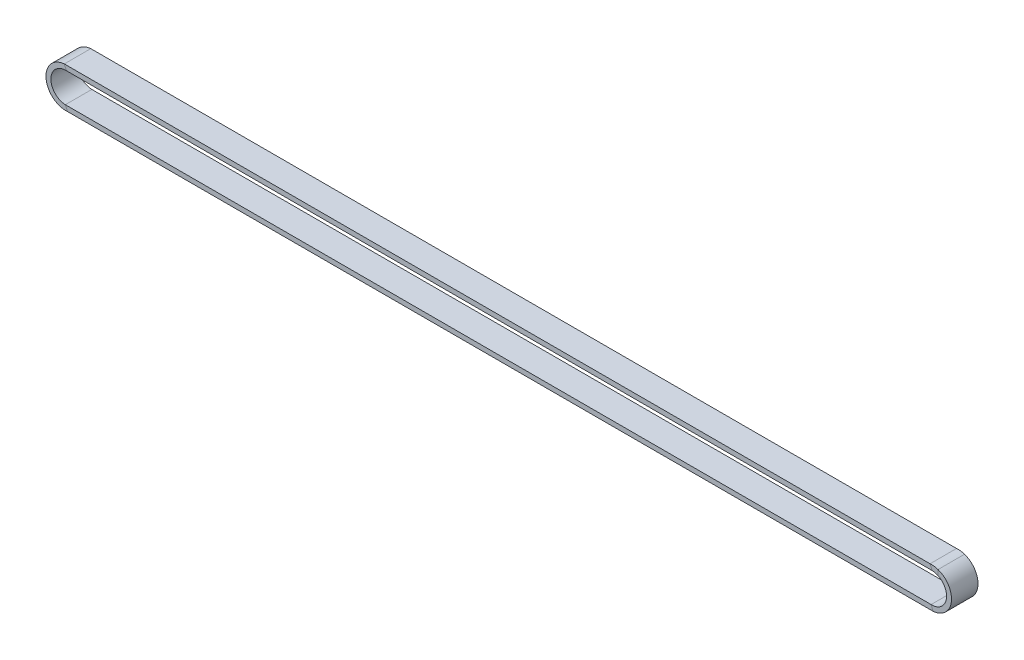
ISO-10303-21;
HEADER;
FILE_DESCRIPTION(('STEP AP214'),'2;1');
FILE_NAME('part.step','',(''),(''),'','','');
FILE_SCHEMA(('AUTOMOTIVE_DESIGN { 1 0 10303 214 1 1 1 1 }'));
ENDSEC;
DATA;
#1=APPLICATION_CONTEXT('core data for automotive mechanical design processes');
#2=APPLICATION_PROTOCOL_DEFINITION('international standard','automotive_design',2000,#1);
#3=PRODUCT_CONTEXT('',#1,'mechanical');
#4=PRODUCT('Part','Part','',(#3));
#5=PRODUCT_RELATED_PRODUCT_CATEGORY('part','',(#4));
#6=PRODUCT_DEFINITION_FORMATION('','',#4);
#7=PRODUCT_DEFINITION_CONTEXT('part definition',#1,'design');
#8=PRODUCT_DEFINITION('design','',#6,#7);
#9=PRODUCT_DEFINITION_SHAPE('','',#8);
#10=(LENGTH_UNIT() NAMED_UNIT(*) SI_UNIT(.MILLI.,.METRE.));
#11=(NAMED_UNIT(*) PLANE_ANGLE_UNIT() SI_UNIT($,.RADIAN.));
#12=(NAMED_UNIT(*) SI_UNIT($,.STERADIAN.) SOLID_ANGLE_UNIT());
#13=UNCERTAINTY_MEASURE_WITH_UNIT(LENGTH_MEASURE(1.E-05),#10,'distance_accuracy_value','');
#14=(GEOMETRIC_REPRESENTATION_CONTEXT(3) GLOBAL_UNCERTAINTY_ASSIGNED_CONTEXT((#13)) GLOBAL_UNIT_ASSIGNED_CONTEXT((#10,
#11,#12)) REPRESENTATION_CONTEXT('',''));
#15=CARTESIAN_POINT('',(0.,0.,0.));
#16=DIRECTION('',(0.,0.,1.));
#17=DIRECTION('',(1.,0.,0.));
#18=AXIS2_PLACEMENT_3D('',#15,#16,#17);
#19=CARTESIAN_POINT('',(-2.42477796092733,27.5000000000043,0.));
#20=DIRECTION('',(0.,0.,-1.));
#21=DIRECTION('',(-1.,0.,0.));
#22=AXIS2_PLACEMENT_3D('',#19,#20,#21);
#23=CYLINDRICAL_SURFACE('',#22,5.65810645935928);
#24=CARTESIAN_POINT('',(-2.42477796092733,27.5000000000043,5.));
#25=DIRECTION('',(0.,0.,-1.));
#26=DIRECTION('',(0.034948504451111,0.999389114427724,0.));
#27=AXIS2_PLACEMENT_3D('',#24,#25,#26);
#28=CIRCLE('',#27,5.65810645935928);
#29=CARTESIAN_POINT('',(-2.22703560214788,33.154650003761,5.));
#30=VERTEX_POINT('',#29);
#31=CARTESIAN_POINT('',(0.,32.6122031009818,5.));
#32=VERTEX_POINT('',#31);
#33=EDGE_CURVE('E11',#30,#32,#28,.T.);
#34=ORIENTED_EDGE('',*,*,#33,.F.);
#35=DIRECTION('',(0.,0.,1.));
#36=VECTOR('',#35,1.);
#37=CARTESIAN_POINT('',(-2.22703560214785,33.154650003761,-5.));
#38=LINE('',#37,#36);
#39=CARTESIAN_POINT('',(-2.22703560214788,33.154650003761,-5.));
#40=VERTEX_POINT('',#39);
#41=EDGE_CURVE('E35',#30,#40,#38,.F.);
#42=ORIENTED_EDGE('',*,*,#41,.T.);
#43=CARTESIAN_POINT('',(-2.42477796092733,27.5000000000043,-5.));
#44=DIRECTION('',(0.,0.,-1.));
#45=DIRECTION('',(0.034948504451111,0.999389114427724,0.));
#46=AXIS2_PLACEMENT_3D('',#43,#44,#45);
#47=CIRCLE('',#46,5.65810645935928);
#48=CARTESIAN_POINT('',(0.,32.6122031009818,-5.));
#49=VERTEX_POINT('',#48);
#50=EDGE_CURVE('E123',#40,#49,#47,.T.);
#51=ORIENTED_EDGE('',*,*,#50,.T.);
#52=DIRECTION('',(0.,0.,1.));
#53=VECTOR('',#52,1.);
#54=CARTESIAN_POINT('',(0.,32.6122031009818,-5.));
#55=LINE('',#54,#53);
#56=EDGE_CURVE('E126',#32,#49,#55,.F.);
#57=ORIENTED_EDGE('',*,*,#56,.F.);
#58=EDGE_LOOP('',(#34,#42,#51,#57));
#59=FACE_BOUND('',#58,.T.);
#60=ADVANCED_FACE('F32',(#59),#23,.F.);
#61=CARTESIAN_POINT('',(-2.22703560214755,33.1546500037612,5.));
#62=DIRECTION('',(0.,0.,1.));
#63=DIRECTION('',(1.,0.,0.));
#64=AXIS2_PLACEMENT_3D('',#61,#62,#63);
#65=PLANE('',#64);
#66=CARTESIAN_POINT('',(-2.42477796092733,27.5000000000043,5.));
#67=DIRECTION('',(0.,0.,-1.));
#68=DIRECTION('',(-0.0792740045307315,0.99685286386992,0.));
#69=AXIS2_PLACEMENT_3D('',#66,#67,#68);
#70=CIRCLE('',#69,7.51418532572582);
#71=CARTESIAN_POINT('',(-3.02045752248276,34.9905371616038,5.));
#72=VERTEX_POINT('',#71);
#73=CARTESIAN_POINT('',(0.,34.6122031009818,5.));
#74=VERTEX_POINT('',#73);
#75=EDGE_CURVE('E40',#72,#74,#70,.T.);
#76=ORIENTED_EDGE('',*,*,#75,.F.);
#77=DIRECTION('',(-0.396710960167461,0.917943578921391,0.));
#78=VECTOR('',#77,1.);
#79=CARTESIAN_POINT('',(-2.22703560214785,33.154650003761,5.));
#80=LINE('',#79,#78);
#81=EDGE_CURVE('E213',#72,#30,#80,.F.);
#82=ORIENTED_EDGE('',*,*,#81,.T.);
#83=ORIENTED_EDGE('',*,*,#33,.T.);
#84=DIRECTION('',(0.,1.,0.));
#85=VECTOR('',#84,1.);
#86=CARTESIAN_POINT('',(0.,32.6122031009818,5.));
#87=LINE('',#86,#85);
#88=EDGE_CURVE('E151',#74,#32,#87,.F.);
#89=ORIENTED_EDGE('',*,*,#88,.F.);
#90=EDGE_LOOP('',(#76,#82,#83,#89));
#91=FACE_BOUND('',#90,.T.);
#92=ADVANCED_FACE('F260',(#91),#65,.T.);
#93=CARTESIAN_POINT('',(-2.42477796092733,27.5000000000043,0.));
#94=DIRECTION('',(0.,0.,-1.));
#95=DIRECTION('',(-1.,0.,0.));
#96=AXIS2_PLACEMENT_3D('',#93,#94,#95);
#97=CYLINDRICAL_SURFACE('',#96,7.51418532572582);
#98=CARTESIAN_POINT('',(-2.42477796092733,27.5000000000043,-5.));
#99=DIRECTION('',(0.,0.,-1.));
#100=DIRECTION('',(-0.0792740045307315,0.99685286386992,0.));
#101=AXIS2_PLACEMENT_3D('',#98,#99,#100);
#102=CIRCLE('',#101,7.51418532572582);
#103=CARTESIAN_POINT('',(-3.02045752248276,34.9905371616038,-5.));
#104=VERTEX_POINT('',#103);
#105=CARTESIAN_POINT('',(0.,34.6122031009818,-5.));
#106=VERTEX_POINT('',#105);
#107=EDGE_CURVE('E132',#104,#106,#102,.T.);
#108=ORIENTED_EDGE('',*,*,#107,.F.);
#109=DIRECTION('',(0.,0.,1.));
#110=VECTOR('',#109,1.);
#111=CARTESIAN_POINT('',(-3.02045752248277,34.9905371616038,-5.));
#112=LINE('',#111,#110);
#113=EDGE_CURVE('E188',#104,#72,#112,.T.);
#114=ORIENTED_EDGE('',*,*,#113,.T.);
#115=ORIENTED_EDGE('',*,*,#75,.T.);
#116=DIRECTION('',(0.,0.,1.));
#117=VECTOR('',#116,1.);
#118=CARTESIAN_POINT('',(0.,34.6122031009818,-5.));
#119=LINE('',#118,#117);
#120=EDGE_CURVE('E155',#106,#74,#119,.T.);
#121=ORIENTED_EDGE('',*,*,#120,.F.);
#122=EDGE_LOOP('',(#108,#114,#115,#121));
#123=FACE_BOUND('',#122,.T.);
#124=ADVANCED_FACE('F264',(#123),#97,.T.);
#125=CARTESIAN_POINT('',(-329.227035601996,33.154650003761,-5.));
#126=DIRECTION('',(0.,-1.,0.));
#127=DIRECTION('',(0.,0.,-1.));
#128=AXIS2_PLACEMENT_3D('',#125,#126,#127);
#129=PLANE('',#128);
#130=ORIENTED_EDGE('',*,*,#41,.F.);
#131=DIRECTION('',(1.,0.,0.));
#132=VECTOR('',#131,1.);
#133=CARTESIAN_POINT('',(-329.227035601996,33.154650003761,5.));
#134=LINE('',#133,#132);
#135=CARTESIAN_POINT('',(-329.227035601996,33.1546500037612,5.));
#136=VERTEX_POINT('',#135);
#137=EDGE_CURVE('E227',#136,#30,#134,.T.);
#138=ORIENTED_EDGE('',*,*,#137,.F.);
#139=DIRECTION('',(0.,0.,1.));
#140=VECTOR('',#139,1.);
#141=CARTESIAN_POINT('',(-329.227035601996,33.1546500037612,-5.));
#142=LINE('',#141,#140);
#143=CARTESIAN_POINT('',(-329.227035601996,33.1546500037612,-5.));
#144=VERTEX_POINT('',#143);
#145=EDGE_CURVE('E191',#136,#144,#142,.F.);
#146=ORIENTED_EDGE('',*,*,#145,.T.);
#147=DIRECTION('',(1.,0.,0.));
#148=VECTOR('',#147,1.);
#149=CARTESIAN_POINT('',(-329.227035601996,33.154650003761,-5.));
#150=LINE('',#149,#148);
#151=EDGE_CURVE('E185',#144,#40,#150,.T.);
#152=ORIENTED_EDGE('',*,*,#151,.T.);
#153=EDGE_LOOP('',(#130,#138,#146,#152));
#154=FACE_BOUND('',#153,.T.);
#155=ADVANCED_FACE('F236',(#154),#129,.T.);
#156=CARTESIAN_POINT('',(-329.227035601996,33.154650003761,5.));
#157=DIRECTION('',(0.,0.,1.));
#158=DIRECTION('',(1.,0.,0.));
#159=AXIS2_PLACEMENT_3D('',#156,#157,#158);
#160=PLANE('',#159);
#161=ORIENTED_EDGE('',*,*,#137,.T.);
#162=ORIENTED_EDGE('',*,*,#81,.F.);
#163=DIRECTION('',(1.,0.,0.));
#164=VECTOR('',#163,1.);
#165=CARTESIAN_POINT('',(-330.020457522331,34.9905371616038,5.));
#166=LINE('',#165,#164);
#167=CARTESIAN_POINT('',(-330.020457522332,34.9905371616034,5.));
#168=VERTEX_POINT('',#167);
#169=EDGE_CURVE('E210',#168,#72,#166,.T.);
#170=ORIENTED_EDGE('',*,*,#169,.F.);
#171=DIRECTION('',(-0.396710960168062,0.917943578921131,0.));
#172=VECTOR('',#171,1.);
#173=CARTESIAN_POINT('',(-329.227035601996,33.1546500037612,5.));
#174=LINE('',#173,#172);
#175=EDGE_CURVE('E206',#168,#136,#174,.F.);
#176=ORIENTED_EDGE('',*,*,#175,.T.);
#177=EDGE_LOOP('',(#161,#162,#170,#176));
#178=FACE_BOUND('',#177,.T.);
#179=ADVANCED_FACE('F273',(#178),#160,.T.);
#180=CARTESIAN_POINT('',(-330.020457522331,34.9905371616038,-5.));
#181=DIRECTION('',(0.,1.,0.));
#182=DIRECTION('',(0.,0.,1.));
#183=AXIS2_PLACEMENT_3D('',#180,#181,#182);
#184=PLANE('',#183);
#185=ORIENTED_EDGE('',*,*,#169,.T.);
#186=ORIENTED_EDGE('',*,*,#113,.F.);
#187=DIRECTION('',(1.,0.,0.));
#188=VECTOR('',#187,1.);
#189=CARTESIAN_POINT('',(-330.020457522331,34.9905371616038,-5.));
#190=LINE('',#189,#188);
#191=CARTESIAN_POINT('',(-330.020457522332,34.9905371616034,-5.));
#192=VERTEX_POINT('',#191);
#193=EDGE_CURVE('E184',#192,#104,#190,.T.);
#194=ORIENTED_EDGE('',*,*,#193,.F.);
#195=DIRECTION('',(0.,0.,1.));
#196=VECTOR('',#195,1.);
#197=CARTESIAN_POINT('',(-330.020457522332,34.9905371616034,-5.));
#198=LINE('',#197,#196);
#199=EDGE_CURVE('E177',#192,#168,#198,.T.);
#200=ORIENTED_EDGE('',*,*,#199,.T.);
#201=EDGE_LOOP('',(#185,#186,#194,#200));
#202=FACE_BOUND('',#201,.T.);
#203=ADVANCED_FACE('F244',(#202),#184,.T.);
#204=CARTESIAN_POINT('',(-329.227035601996,33.154650003761,-5.));
#205=DIRECTION('',(0.,0.,-1.));
#206=DIRECTION('',(-1.,0.,0.));
#207=AXIS2_PLACEMENT_3D('',#204,#205,#206);
#208=PLANE('',#207);
#209=ORIENTED_EDGE('',*,*,#193,.T.);
#210=DIRECTION('',(-0.396710960167461,0.917943578921391,0.));
#211=VECTOR('',#210,1.);
#212=CARTESIAN_POINT('',(-2.22703560214785,33.154650003761,-5.));
#213=LINE('',#212,#211);
#214=EDGE_CURVE('E182',#40,#104,#213,.T.);
#215=ORIENTED_EDGE('',*,*,#214,.F.);
#216=ORIENTED_EDGE('',*,*,#151,.F.);
#217=DIRECTION('',(-0.396710960168062,0.917943578921131,0.));
#218=VECTOR('',#217,1.);
#219=CARTESIAN_POINT('',(-329.227035601996,33.1546500037612,-5.));
#220=LINE('',#219,#218);
#221=EDGE_CURVE('E174',#144,#192,#220,.T.);
#222=ORIENTED_EDGE('',*,*,#221,.T.);
#223=EDGE_LOOP('',(#209,#215,#216,#222));
#224=FACE_BOUND('',#223,.T.);
#225=ADVANCED_FACE('F241',(#224),#208,.T.);
#226=CARTESIAN_POINT('',(-329.424777960776,27.5000000000043,0.));
#227=DIRECTION('',(0.,0.,-1.));
#228=DIRECTION('',(-1.,0.,0.));
#229=AXIS2_PLACEMENT_3D('',#226,#227,#228);
#230=CYLINDRICAL_SURFACE('',#229,5.65810645935927);
#231=ORIENTED_EDGE('',*,*,#145,.F.);
#232=CARTESIAN_POINT('',(-329.424777960776,27.5000000000043,5.));
#233=DIRECTION('',(0.,0.,-1.));
#234=DIRECTION('',(-0.0349485044511122,-0.999389114427724,0.));
#235=AXIS2_PLACEMENT_3D('',#232,#233,#234);
#236=CIRCLE('',#235,5.65810645935927);
#237=CARTESIAN_POINT('',(-329.622520319555,21.8453499962476,5.));
#238=VERTEX_POINT('',#237);
#239=EDGE_CURVE('E81',#238,#136,#236,.T.);
#240=ORIENTED_EDGE('',*,*,#239,.F.);
#241=DIRECTION('',(0.,0.,1.));
#242=VECTOR('',#241,1.);
#243=CARTESIAN_POINT('',(-329.622520319555,21.8453499962476,-5.));
#244=LINE('',#243,#242);
#245=CARTESIAN_POINT('',(-329.622520319555,21.8453499962476,-5.));
#246=VERTEX_POINT('',#245);
#247=EDGE_CURVE('E181',#238,#246,#244,.F.);
#248=ORIENTED_EDGE('',*,*,#247,.T.);
#249=CARTESIAN_POINT('',(-329.424777960776,27.5000000000043,-5.));
#250=DIRECTION('',(0.,0.,-1.));
#251=DIRECTION('',(-0.0349485044511122,-0.999389114427724,0.));
#252=AXIS2_PLACEMENT_3D('',#249,#250,#251);
#253=CIRCLE('',#252,5.65810645935927);
#254=EDGE_CURVE('E179',#246,#144,#253,.T.);
#255=ORIENTED_EDGE('',*,*,#254,.T.);
#256=EDGE_LOOP('',(#231,#240,#248,#255));
#257=FACE_BOUND('',#256,.T.);
#258=ADVANCED_FACE('F255',(#257),#230,.F.);
#259=CARTESIAN_POINT('',(-329.622520319555,21.8453499962474,5.));
#260=DIRECTION('',(0.,0.,1.));
#261=DIRECTION('',(1.,0.,0.));
#262=AXIS2_PLACEMENT_3D('',#259,#260,#261);
#263=PLANE('',#262);
#264=ORIENTED_EDGE('',*,*,#239,.T.);
#265=ORIENTED_EDGE('',*,*,#175,.F.);
#266=CARTESIAN_POINT('',(-329.424777960776,27.5000000000043,5.));
#267=DIRECTION('',(0.,0.,-1.));
#268=DIRECTION('',(0.0792740045307351,-0.99685286386992,0.));
#269=AXIS2_PLACEMENT_3D('',#266,#267,#268);
#270=CIRCLE('',#269,7.51418532572582);
#271=CARTESIAN_POINT('',(-328.82909839922,20.0094628384048,5.));
#272=VERTEX_POINT('',#271);
#273=EDGE_CURVE('E91',#272,#168,#270,.T.);
#274=ORIENTED_EDGE('',*,*,#273,.F.);
#275=DIRECTION('',(0.396710960167461,-0.917943578921391,0.));
#276=VECTOR('',#275,1.);
#277=CARTESIAN_POINT('',(-329.622520319555,21.8453499962476,5.));
#278=LINE('',#277,#276);
#279=EDGE_CURVE('E203',#272,#238,#278,.F.);
#280=ORIENTED_EDGE('',*,*,#279,.T.);
#281=EDGE_LOOP('',(#264,#265,#274,#280));
#282=FACE_BOUND('',#281,.T.);
#283=ADVANCED_FACE('F247',(#282),#263,.T.);
#284=CARTESIAN_POINT('',(-329.424777960776,27.5000000000043,0.));
#285=DIRECTION('',(0.,0.,-1.));
#286=DIRECTION('',(-1.,0.,0.));
#287=AXIS2_PLACEMENT_3D('',#284,#285,#286);
#288=CYLINDRICAL_SURFACE('',#287,7.51418532572582);
#289=ORIENTED_EDGE('',*,*,#273,.T.);
#290=ORIENTED_EDGE('',*,*,#199,.F.);
#291=CARTESIAN_POINT('',(-329.424777960776,27.5000000000043,-5.));
#292=DIRECTION('',(0.,0.,-1.));
#293=DIRECTION('',(0.0792740045307351,-0.99685286386992,0.));
#294=AXIS2_PLACEMENT_3D('',#291,#292,#293);
#295=CIRCLE('',#294,7.51418532572582);
#296=CARTESIAN_POINT('',(-328.82909839922,20.0094628384048,-5.));
#297=VERTEX_POINT('',#296);
#298=EDGE_CURVE('E99',#297,#192,#295,.T.);
#299=ORIENTED_EDGE('',*,*,#298,.F.);
#300=DIRECTION('',(0.,0.,1.));
#301=VECTOR('',#300,1.);
#302=CARTESIAN_POINT('',(-328.82909839922,20.0094628384048,-5.));
#303=LINE('',#302,#301);
#304=EDGE_CURVE('E170',#297,#272,#303,.T.);
#305=ORIENTED_EDGE('',*,*,#304,.T.);
#306=EDGE_LOOP('',(#289,#290,#299,#305));
#307=FACE_BOUND('',#306,.T.);
#308=ADVANCED_FACE('F245',(#307),#288,.T.);
#309=CARTESIAN_POINT('',(-329.622520319555,21.8453499962474,-5.));
#310=DIRECTION('',(0.,0.,-1.));
#311=DIRECTION('',(-1.,0.,0.));
#312=AXIS2_PLACEMENT_3D('',#309,#310,#311);
#313=PLANE('',#312);
#314=ORIENTED_EDGE('',*,*,#298,.T.);
#315=ORIENTED_EDGE('',*,*,#221,.F.);
#316=ORIENTED_EDGE('',*,*,#254,.F.);
#317=DIRECTION('',(0.396710960167461,-0.917943578921391,0.));
#318=VECTOR('',#317,1.);
#319=CARTESIAN_POINT('',(-329.622520319555,21.8453499962476,-5.));
#320=LINE('',#319,#318);
#321=EDGE_CURVE('E164',#246,#297,#320,.T.);
#322=ORIENTED_EDGE('',*,*,#321,.T.);
#323=EDGE_LOOP('',(#314,#315,#316,#322));
#324=FACE_BOUND('',#323,.T.);
#325=ADVANCED_FACE('F239',(#324),#313,.T.);
#326=CARTESIAN_POINT('',(-2.62252031970681,21.8453499962476,-5.));
#327=DIRECTION('',(0.,1.,0.));
#328=DIRECTION('',(0.,0.,1.));
#329=AXIS2_PLACEMENT_3D('',#326,#327,#328);
#330=PLANE('',#329);
#331=ORIENTED_EDGE('',*,*,#247,.F.);
#332=DIRECTION('',(-1.,0.,0.));
#333=VECTOR('',#332,1.);
#334=CARTESIAN_POINT('',(-2.62252031970681,21.8453499962476,5.));
#335=LINE('',#334,#333);
#336=CARTESIAN_POINT('',(-2.6225203197071,21.8453499962474,5.));
#337=VERTEX_POINT('',#336);
#338=EDGE_CURVE('E220',#337,#238,#335,.T.);
#339=ORIENTED_EDGE('',*,*,#338,.F.);
#340=DIRECTION('',(0.,0.,1.));
#341=VECTOR('',#340,1.);
#342=CARTESIAN_POINT('',(-2.6225203197071,21.8453499962474,-5.));
#343=LINE('',#342,#341);
#344=CARTESIAN_POINT('',(-2.6225203197071,21.8453499962474,-5.));
#345=VERTEX_POINT('',#344);
#346=EDGE_CURVE('E173',#337,#345,#343,.F.);
#347=ORIENTED_EDGE('',*,*,#346,.T.);
#348=DIRECTION('',(-1.,0.,0.));
#349=VECTOR('',#348,1.);
#350=CARTESIAN_POINT('',(-2.62252031970681,21.8453499962476,-5.));
#351=LINE('',#350,#349);
#352=EDGE_CURVE('E167',#345,#246,#351,.T.);
#353=ORIENTED_EDGE('',*,*,#352,.T.);
#354=EDGE_LOOP('',(#331,#339,#347,#353));
#355=FACE_BOUND('',#354,.T.);
#356=ADVANCED_FACE('F253',(#355),#330,.T.);
#357=CARTESIAN_POINT('',(-2.62252031970681,21.8453499962476,5.));
#358=DIRECTION('',(0.,0.,1.));
#359=DIRECTION('',(1.,0.,0.));
#360=AXIS2_PLACEMENT_3D('',#357,#358,#359);
#361=PLANE('',#360);
#362=ORIENTED_EDGE('',*,*,#338,.T.);
#363=ORIENTED_EDGE('',*,*,#279,.F.);
#364=DIRECTION('',(-1.,0.,0.));
#365=VECTOR('',#364,1.);
#366=CARTESIAN_POINT('',(-1.82909839937188,20.0094628384048,5.));
#367=LINE('',#366,#365);
#368=CARTESIAN_POINT('',(-1.82909839937098,20.0094628384052,5.));
#369=VERTEX_POINT('',#368);
#370=EDGE_CURVE('E200',#369,#272,#367,.T.);
#371=ORIENTED_EDGE('',*,*,#370,.F.);
#372=DIRECTION('',(0.396710960168062,-0.917943578921131,0.));
#373=VECTOR('',#372,1.);
#374=CARTESIAN_POINT('',(-2.6225203197071,21.8453499962474,5.));
#375=LINE('',#374,#373);
#376=EDGE_CURVE('E198',#369,#337,#375,.F.);
#377=ORIENTED_EDGE('',*,*,#376,.T.);
#378=EDGE_LOOP('',(#362,#363,#371,#377));
#379=FACE_BOUND('',#378,.T.);
#380=ADVANCED_FACE('F280',(#379),#361,.T.);
#381=CARTESIAN_POINT('',(-1.82909839937188,20.0094628384048,-5.));
#382=DIRECTION('',(0.,-1.,0.));
#383=DIRECTION('',(0.,0.,-1.));
#384=AXIS2_PLACEMENT_3D('',#381,#382,#383);
#385=PLANE('',#384);
#386=ORIENTED_EDGE('',*,*,#370,.T.);
#387=ORIENTED_EDGE('',*,*,#304,.F.);
#388=DIRECTION('',(-1.,0.,0.));
#389=VECTOR('',#388,1.);
#390=CARTESIAN_POINT('',(-1.82909839937188,20.0094628384048,-5.));
#391=LINE('',#390,#389);
#392=CARTESIAN_POINT('',(-1.82909839937098,20.0094628384052,-5.));
#393=VERTEX_POINT('',#392);
#394=EDGE_CURVE('E166',#393,#297,#391,.T.);
#395=ORIENTED_EDGE('',*,*,#394,.F.);
#396=DIRECTION('',(0.,0.,1.));
#397=VECTOR('',#396,1.);
#398=CARTESIAN_POINT('',(-1.82909839937098,20.0094628384052,-5.));
#399=LINE('',#398,#397);
#400=EDGE_CURVE('E162',#393,#369,#399,.T.);
#401=ORIENTED_EDGE('',*,*,#400,.T.);
#402=EDGE_LOOP('',(#386,#387,#395,#401));
#403=FACE_BOUND('',#402,.T.);
#404=ADVANCED_FACE('F300',(#403),#385,.T.);
#405=CARTESIAN_POINT('',(-2.62252031970681,21.8453499962476,-5.));
#406=DIRECTION('',(0.,0.,-1.));
#407=DIRECTION('',(-1.,0.,0.));
#408=AXIS2_PLACEMENT_3D('',#405,#406,#407);
#409=PLANE('',#408);
#410=ORIENTED_EDGE('',*,*,#394,.T.);
#411=ORIENTED_EDGE('',*,*,#321,.F.);
#412=ORIENTED_EDGE('',*,*,#352,.F.);
#413=DIRECTION('',(0.396710960168062,-0.917943578921131,0.));
#414=VECTOR('',#413,1.);
#415=CARTESIAN_POINT('',(-2.6225203197071,21.8453499962474,-5.));
#416=LINE('',#415,#414);
#417=EDGE_CURVE('E143',#345,#393,#416,.T.);
#418=ORIENTED_EDGE('',*,*,#417,.T.);
#419=EDGE_LOOP('',(#410,#411,#412,#418));
#420=FACE_BOUND('',#419,.T.);
#421=ADVANCED_FACE('F277',(#420),#409,.T.);
#422=CARTESIAN_POINT('',(-2.42477796092733,27.5000000000043,0.));
#423=DIRECTION('',(0.,0.,-1.));
#424=DIRECTION('',(-1.,0.,0.));
#425=AXIS2_PLACEMENT_3D('',#422,#423,#424);
#426=CYLINDRICAL_SURFACE('',#425,5.65810645935927);
#427=ORIENTED_EDGE('',*,*,#346,.F.);
#428=CARTESIAN_POINT('',(-2.42477796092733,27.5000000000043,5.));
#429=DIRECTION('',(0.,0.,-1.));
#430=DIRECTION('',(0.428549370419925,0.903518365675367,0.));
#431=AXIS2_PLACEMENT_3D('',#428,#429,#430);
#432=CIRCLE('',#431,5.65810645935927);
#433=EDGE_CURVE('E150',#32,#337,#432,.T.);
#434=ORIENTED_EDGE('',*,*,#433,.F.);
#435=ORIENTED_EDGE('',*,*,#56,.T.);
#436=CARTESIAN_POINT('',(-2.42477796092733,27.5000000000043,-5.));
#437=DIRECTION('',(0.,0.,-1.));
#438=DIRECTION('',(0.428549370419925,0.903518365675367,0.));
#439=AXIS2_PLACEMENT_3D('',#436,#437,#438);
#440=CIRCLE('',#439,5.65810645935927);
#441=EDGE_CURVE('E138',#49,#345,#440,.T.);
#442=ORIENTED_EDGE('',*,*,#441,.T.);
#443=EDGE_LOOP('',(#427,#434,#435,#442));
#444=FACE_BOUND('',#443,.T.);
#445=ADVANCED_FACE('F148',(#444),#426,.F.);
#446=CARTESIAN_POINT('',(0.,32.6122031009818,5.));
#447=DIRECTION('',(0.,0.,1.));
#448=DIRECTION('',(1.,0.,0.));
#449=AXIS2_PLACEMENT_3D('',#446,#447,#448);
#450=PLANE('',#449);
#451=ORIENTED_EDGE('',*,*,#433,.T.);
#452=ORIENTED_EDGE('',*,*,#376,.F.);
#453=CARTESIAN_POINT('',(-2.42477796092733,27.5000000000043,5.));
#454=DIRECTION('',(0.,0.,-1.));
#455=DIRECTION('',(0.322693393337768,0.946503551972287,0.));
#456=AXIS2_PLACEMENT_3D('',#453,#454,#455);
#457=CIRCLE('',#456,7.51418532572582);
#458=EDGE_CURVE('E195',#74,#369,#457,.T.);
#459=ORIENTED_EDGE('',*,*,#458,.F.);
#460=ORIENTED_EDGE('',*,*,#88,.T.);
#461=EDGE_LOOP('',(#451,#452,#459,#460));
#462=FACE_BOUND('',#461,.T.);
#463=ADVANCED_FACE('F276',(#462),#450,.T.);
#464=CARTESIAN_POINT('',(-2.42477796092733,27.5000000000043,0.));
#465=DIRECTION('',(0.,0.,-1.));
#466=DIRECTION('',(-1.,0.,0.));
#467=AXIS2_PLACEMENT_3D('',#464,#465,#466);
#468=CYLINDRICAL_SURFACE('',#467,7.51418532572582);
#469=ORIENTED_EDGE('',*,*,#458,.T.);
#470=ORIENTED_EDGE('',*,*,#400,.F.);
#471=CARTESIAN_POINT('',(-2.42477796092733,27.5000000000043,-5.));
#472=DIRECTION('',(0.,0.,-1.));
#473=DIRECTION('',(0.322693393337768,0.946503551972287,0.));
#474=AXIS2_PLACEMENT_3D('',#471,#472,#473);
#475=CIRCLE('',#474,7.51418532572582);
#476=EDGE_CURVE('E161',#106,#393,#475,.T.);
#477=ORIENTED_EDGE('',*,*,#476,.F.);
#478=ORIENTED_EDGE('',*,*,#120,.T.);
#479=EDGE_LOOP('',(#469,#470,#477,#478));
#480=FACE_BOUND('',#479,.T.);
#481=ADVANCED_FACE('F295',(#480),#468,.T.);
#482=CARTESIAN_POINT('',(0.,32.6122031009818,-5.));
#483=DIRECTION('',(0.,0.,-1.));
#484=DIRECTION('',(-1.,0.,0.));
#485=AXIS2_PLACEMENT_3D('',#482,#483,#484);
#486=PLANE('',#485);
#487=ORIENTED_EDGE('',*,*,#476,.T.);
#488=ORIENTED_EDGE('',*,*,#417,.F.);
#489=ORIENTED_EDGE('',*,*,#441,.F.);
#490=DIRECTION('',(0.,1.,0.));
#491=VECTOR('',#490,1.);
#492=CARTESIAN_POINT('',(0.,32.6122031009818,-5.));
#493=LINE('',#492,#491);
#494=EDGE_CURVE('E141',#49,#106,#493,.T.);
#495=ORIENTED_EDGE('',*,*,#494,.T.);
#496=EDGE_LOOP('',(#487,#488,#489,#495));
#497=FACE_BOUND('',#496,.T.);
#498=ADVANCED_FACE('F140',(#497),#486,.T.);
#499=CARTESIAN_POINT('',(-2.22703560214755,33.1546500037612,-5.));
#500=DIRECTION('',(0.,0.,-1.));
#501=DIRECTION('',(-1.,0.,0.));
#502=AXIS2_PLACEMENT_3D('',#499,#500,#501);
#503=PLANE('',#502);
#504=ORIENTED_EDGE('',*,*,#214,.T.);
#505=ORIENTED_EDGE('',*,*,#107,.T.);
#506=ORIENTED_EDGE('',*,*,#494,.F.);
#507=ORIENTED_EDGE('',*,*,#50,.F.);
#508=EDGE_LOOP('',(#504,#505,#506,#507));
#509=FACE_BOUND('',#508,.T.);
#510=ADVANCED_FACE('F153',(#509),#503,.T.);
#511=CLOSED_SHELL('',(#60,#92,#124,#155,#179,#203,#225,#258,#283,#308,#325,#356,#380,#404,#421,
#445,#463,#481,#498,#510));
#512=MANIFOLD_SOLID_BREP('B2',#511);
#513=ADVANCED_BREP_SHAPE_REPRESENTATION('',(#18,#512),#14);
#514=SHAPE_DEFINITION_REPRESENTATION(#9,#513);
ENDSEC;
END-ISO-10303-21;
